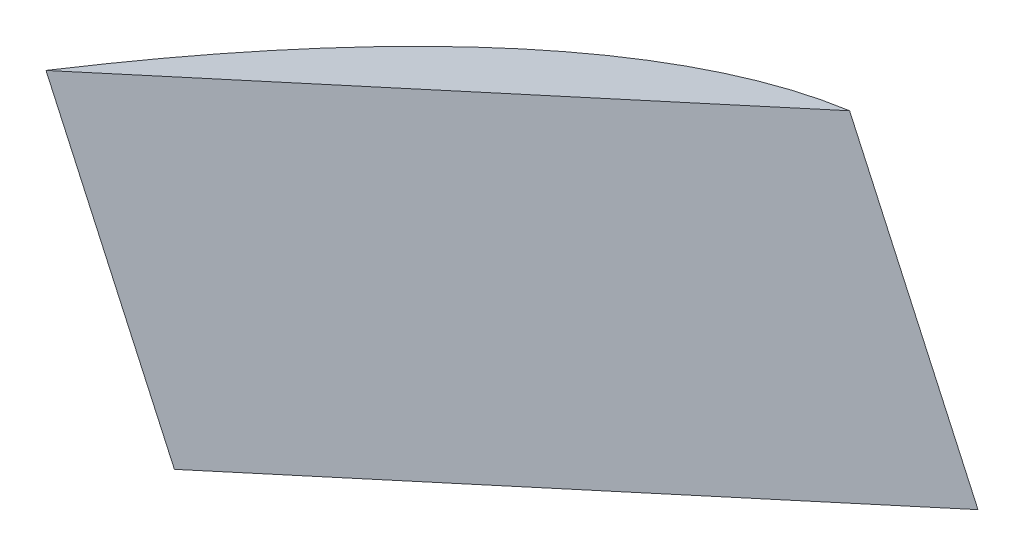
ISO-10303-21;
HEADER;
FILE_DESCRIPTION(('STEP AP214'),'2;1');
FILE_NAME('part.step','',(''),(''),'','','');
FILE_SCHEMA(('AUTOMOTIVE_DESIGN { 1 0 10303 214 1 1 1 1 }'));
ENDSEC;
DATA;
#1=APPLICATION_CONTEXT('core data for automotive mechanical design processes');
#2=APPLICATION_PROTOCOL_DEFINITION('international standard','automotive_design',2000,#1);
#3=PRODUCT_CONTEXT('',#1,'mechanical');
#4=PRODUCT('Part','Part','',(#3));
#5=PRODUCT_RELATED_PRODUCT_CATEGORY('part','',(#4));
#6=PRODUCT_DEFINITION_FORMATION('','',#4);
#7=PRODUCT_DEFINITION_CONTEXT('part definition',#1,'design');
#8=PRODUCT_DEFINITION('design','',#6,#7);
#9=PRODUCT_DEFINITION_SHAPE('','',#8);
#10=(LENGTH_UNIT() NAMED_UNIT(*) SI_UNIT(.MILLI.,.METRE.));
#11=(NAMED_UNIT(*) PLANE_ANGLE_UNIT() SI_UNIT($,.RADIAN.));
#12=(NAMED_UNIT(*) SI_UNIT($,.STERADIAN.) SOLID_ANGLE_UNIT());
#13=UNCERTAINTY_MEASURE_WITH_UNIT(LENGTH_MEASURE(1.E-05),#10,'distance_accuracy_value','');
#14=(GEOMETRIC_REPRESENTATION_CONTEXT(3) GLOBAL_UNCERTAINTY_ASSIGNED_CONTEXT((#13)) GLOBAL_UNIT_ASSIGNED_CONTEXT((#10,
#11,#12)) REPRESENTATION_CONTEXT('',''));
#15=CARTESIAN_POINT('',(0.,0.,0.));
#16=DIRECTION('',(0.,0.,1.));
#17=DIRECTION('',(1.,0.,0.));
#18=AXIS2_PLACEMENT_3D('',#15,#16,#17);
#19=CARTESIAN_POINT('',(118.298478951673,-116.705459973309,148.265045314197));
#20=DIRECTION('',(-0.4153201570282,0.90967530864923,0.));
#21=DIRECTION('',(-0.90967530864923,-0.4153201570282,0.));
#22=AXIS2_PLACEMENT_3D('',#19,#20,#21);
#23=CYLINDRICAL_SURFACE('',#22,188.091537238848);
#24=DIRECTION('',(-0.4153201570282,0.90967530864923,0.));
#25=VECTOR('',#24,1.);
#26=CARTESIAN_POINT('',(63.7179604327189,-141.624669395001,-30.0000000000001));
#27=LINE('',#26,#25);
#28=CARTESIAN_POINT('',(63.7179604327189,-141.624669395001,-30.0000000000001));
#29=VERTEX_POINT('',#28);
#30=CARTESIAN_POINT('',(46.2745138375345,-103.418306431733,-30.0000000000001));
#31=VERTEX_POINT('',#30);
#32=EDGE_CURVE('E47',#29,#31,#27,.T.);
#33=ORIENTED_EDGE('',*,*,#32,.T.);
#34=CARTESIAN_POINT('',(100.855032356488,-78.4990970100412,148.265045314197));
#35=DIRECTION('',(0.4153201570282,-0.90967530864923,0.));
#36=DIRECTION('',(-0.90967530864923,-0.4153201570282,0.));
#37=AXIS2_PLACEMENT_3D('',#34,#35,#36);
#38=CIRCLE('',#37,188.091537238848);
#39=CARTESIAN_POINT('',(155.435550875442,-53.5798875883492,-30.0000000000001));
#40=VERTEX_POINT('',#39);
#41=EDGE_CURVE('E70',#31,#40,#38,.T.);
#42=ORIENTED_EDGE('',*,*,#41,.T.);
#43=DIRECTION('',(-0.4153201570282,0.90967530864923,0.));
#44=VECTOR('',#43,1.);
#45=CARTESIAN_POINT('',(172.878997470627,-91.7862505516168,-30.0000000000001));
#46=LINE('',#45,#44);
#47=CARTESIAN_POINT('',(172.878997470627,-91.7862505516168,-30.0000000000001));
#48=VERTEX_POINT('',#47);
#49=EDGE_CURVE('E11',#48,#40,#46,.T.);
#50=ORIENTED_EDGE('',*,*,#49,.F.);
#51=CARTESIAN_POINT('',(118.298478951673,-116.705459973309,148.265045314197));
#52=DIRECTION('',(0.4153201570282,-0.90967530864923,0.));
#53=DIRECTION('',(-0.90967530864923,-0.4153201570282,0.));
#54=AXIS2_PLACEMENT_3D('',#51,#52,#53);
#55=CIRCLE('',#54,188.091537238848);
#56=EDGE_CURVE('E76',#29,#48,#55,.T.);
#57=ORIENTED_EDGE('',*,*,#56,.F.);
#58=EDGE_LOOP('',(#33,#42,#50,#57));
#59=FACE_BOUND('',#58,.T.);
#60=ADVANCED_FACE('F39',(#59),#23,.T.);
#61=CARTESIAN_POINT('',(172.878997470627,-91.7862505516168,-30.0000000000001));
#62=DIRECTION('',(0.,0.,-1.));
#63=DIRECTION('',(0.,1.,0.));
#64=AXIS2_PLACEMENT_3D('',#61,#62,#63);
#65=PLANE('',#64);
#66=ORIENTED_EDGE('',*,*,#49,.T.);
#67=DIRECTION('',(-0.90967530864923,-0.4153201570282,0.));
#68=VECTOR('',#67,1.);
#69=CARTESIAN_POINT('',(155.435550875442,-53.5798875883492,-30.0000000000001));
#70=LINE('',#69,#68);
#71=EDGE_CURVE('E66',#40,#31,#70,.T.);
#72=ORIENTED_EDGE('',*,*,#71,.T.);
#73=ORIENTED_EDGE('',*,*,#32,.F.);
#74=DIRECTION('',(-0.90967530864923,-0.4153201570282,0.));
#75=VECTOR('',#74,1.);
#76=CARTESIAN_POINT('',(172.878997470627,-91.7862505516168,-30.0000000000001));
#77=LINE('',#76,#75);
#78=EDGE_CURVE('E53',#48,#29,#77,.T.);
#79=ORIENTED_EDGE('',*,*,#78,.F.);
#80=EDGE_LOOP('',(#66,#72,#73,#79));
#81=FACE_BOUND('',#80,.T.);
#82=ADVANCED_FACE('F64',(#81),#65,.F.);
#83=CARTESIAN_POINT('',(118.298478951673,-116.705459973309,148.265045314197));
#84=DIRECTION('',(-0.4153201570282,0.90967530864923,0.));
#85=DIRECTION('',(-0.90967530864923,-0.4153201570282,0.));
#86=AXIS2_PLACEMENT_3D('',#83,#84,#85);
#87=PLANE('',#86);
#88=ORIENTED_EDGE('',*,*,#56,.T.);
#89=ORIENTED_EDGE('',*,*,#78,.T.);
#90=EDGE_LOOP('',(#88,#89));
#91=FACE_BOUND('',#90,.T.);
#92=ADVANCED_FACE('F83',(#91),#87,.F.);
#93=CARTESIAN_POINT('',(100.855032356488,-78.4990970100412,148.265045314197));
#94=DIRECTION('',(-0.4153201570282,0.90967530864923,0.));
#95=DIRECTION('',(-0.90967530864923,-0.4153201570282,0.));
#96=AXIS2_PLACEMENT_3D('',#93,#94,#95);
#97=PLANE('',#96);
#98=ORIENTED_EDGE('',*,*,#41,.F.);
#99=ORIENTED_EDGE('',*,*,#71,.F.);
#100=EDGE_LOOP('',(#98,#99));
#101=FACE_BOUND('',#100,.T.);
#102=ADVANCED_FACE('F74',(#101),#97,.T.);
#103=CLOSED_SHELL('',(#60,#82,#92,#102));
#104=MANIFOLD_SOLID_BREP('B2',#103);
#105=ADVANCED_BREP_SHAPE_REPRESENTATION('',(#18,#104),#14);
#106=SHAPE_DEFINITION_REPRESENTATION(#9,#105);
ENDSEC;
END-ISO-10303-21;
